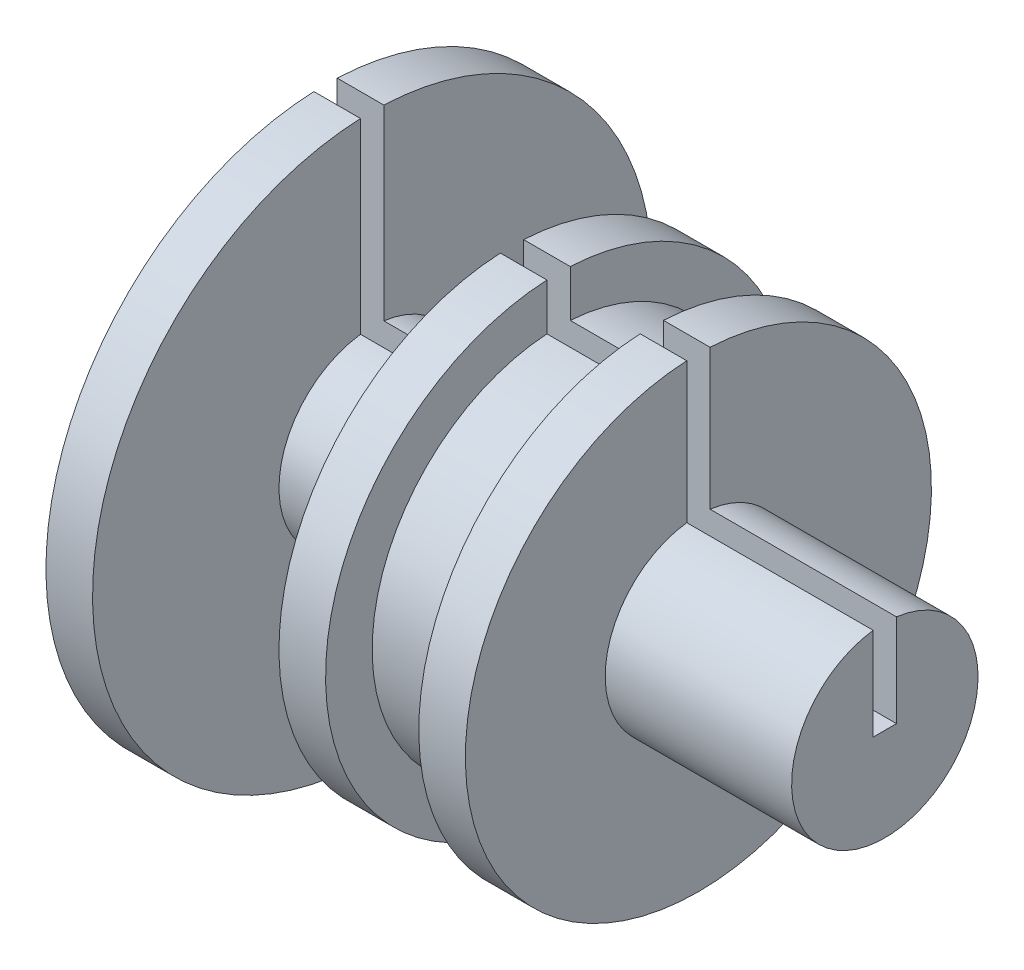
ISO-10303-21;
HEADER;
FILE_DESCRIPTION(('STEP AP214'),'2;1');
FILE_NAME('part.step','',(''),(''),'','','');
FILE_SCHEMA(('AUTOMOTIVE_DESIGN { 1 0 10303 214 1 1 1 1 }'));
ENDSEC;
DATA;
#1=APPLICATION_CONTEXT('core data for automotive mechanical design processes');
#2=APPLICATION_PROTOCOL_DEFINITION('international standard','automotive_design',2000,#1);
#3=PRODUCT_CONTEXT('',#1,'mechanical');
#4=PRODUCT('Part','Part','',(#3));
#5=PRODUCT_RELATED_PRODUCT_CATEGORY('part','',(#4));
#6=PRODUCT_DEFINITION_FORMATION('','',#4);
#7=PRODUCT_DEFINITION_CONTEXT('part definition',#1,'design');
#8=PRODUCT_DEFINITION('design','',#6,#7);
#9=PRODUCT_DEFINITION_SHAPE('','',#8);
#10=(LENGTH_UNIT() NAMED_UNIT(*) SI_UNIT(.MILLI.,.METRE.));
#11=(NAMED_UNIT(*) PLANE_ANGLE_UNIT() SI_UNIT($,.RADIAN.));
#12=(NAMED_UNIT(*) SI_UNIT($,.STERADIAN.) SOLID_ANGLE_UNIT());
#13=UNCERTAINTY_MEASURE_WITH_UNIT(LENGTH_MEASURE(1.E-05),#10,'distance_accuracy_value','');
#14=(GEOMETRIC_REPRESENTATION_CONTEXT(3) GLOBAL_UNCERTAINTY_ASSIGNED_CONTEXT((#13)) GLOBAL_UNIT_ASSIGNED_CONTEXT((#10,
#11,#12)) REPRESENTATION_CONTEXT('',''));
#15=CARTESIAN_POINT('',(0.,0.,0.));
#16=DIRECTION('',(0.,0.,1.));
#17=DIRECTION('',(1.,0.,0.));
#18=AXIS2_PLACEMENT_3D('',#15,#16,#17);
#19=CARTESIAN_POINT('',(0.,30.,0.));
#20=DIRECTION('',(1.,0.,0.));
#21=DIRECTION('',(0.,0.,-1.));
#22=AXIS2_PLACEMENT_3D('',#19,#20,#21);
#23=PLANE('',#22);
#24=CARTESIAN_POINT('',(0.,0.,0.));
#25=DIRECTION('',(-1.,0.,0.));
#26=DIRECTION('',(0.,0.,1.));
#27=AXIS2_PLACEMENT_3D('',#24,#25,#26);
#28=CIRCLE('',#27,30.);
#29=CARTESIAN_POINT('',(0.,29.9739470207045,-1.25));
#30=VERTEX_POINT('',#29);
#31=CARTESIAN_POINT('',(0.,29.9739470207045,1.25));
#32=VERTEX_POINT('',#31);
#33=EDGE_CURVE('E152',#30,#32,#28,.T.);
#34=ORIENTED_EDGE('',*,*,#33,.T.);
#35=DIRECTION('',(0.,-1.,0.));
#36=VECTOR('',#35,1.);
#37=CARTESIAN_POINT('',(0.,34.9570415765441,1.25));
#38=LINE('',#37,#36);
#39=CARTESIAN_POINT('',(0.,0.,1.25));
#40=VERTEX_POINT('',#39);
#41=EDGE_CURVE('E134',#32,#40,#38,.T.);
#42=ORIENTED_EDGE('',*,*,#41,.T.);
#43=DIRECTION('',(0.,0.,-1.));
#44=VECTOR('',#43,1.);
#45=CARTESIAN_POINT('',(0.,0.,1.25));
#46=LINE('',#45,#44);
#47=CARTESIAN_POINT('',(0.,0.,-1.25));
#48=VERTEX_POINT('',#47);
#49=EDGE_CURVE('E144',#40,#48,#46,.T.);
#50=ORIENTED_EDGE('',*,*,#49,.T.);
#51=DIRECTION('',(0.,1.,0.));
#52=VECTOR('',#51,1.);
#53=CARTESIAN_POINT('',(0.,34.9570415765441,-1.25));
#54=LINE('',#53,#52);
#55=EDGE_CURVE('E141',#48,#30,#54,.T.);
#56=ORIENTED_EDGE('',*,*,#55,.T.);
#57=EDGE_LOOP('',(#34,#42,#50,#56));
#58=FACE_BOUND('',#57,.T.);
#59=ADVANCED_FACE('F32',(#58),#23,.F.);
#60=CARTESIAN_POINT('',(60.,0.,0.));
#61=DIRECTION('',(-1.,0.,0.));
#62=DIRECTION('',(0.,0.,1.));
#63=AXIS2_PLACEMENT_3D('',#60,#61,#62);
#64=PLANE('',#63);
#65=DIRECTION('',(0.,0.,-1.));
#66=VECTOR('',#65,1.);
#67=CARTESIAN_POINT('',(60.,0.,1.25));
#68=LINE('',#67,#66);
#69=CARTESIAN_POINT('',(60.,0.,1.25));
#70=VERTEX_POINT('',#69);
#71=CARTESIAN_POINT('',(60.,0.,-1.25));
#72=VERTEX_POINT('',#71);
#73=EDGE_CURVE('E155',#70,#72,#68,.T.);
#74=ORIENTED_EDGE('',*,*,#73,.F.);
#75=DIRECTION('',(0.,-1.,0.));
#76=VECTOR('',#75,1.);
#77=CARTESIAN_POINT('',(60.,34.9570415765441,1.25));
#78=LINE('',#77,#76);
#79=CARTESIAN_POINT('',(60.,9.92156741649222,1.25));
#80=VERTEX_POINT('',#79);
#81=EDGE_CURVE('E136',#80,#70,#78,.T.);
#82=ORIENTED_EDGE('',*,*,#81,.F.);
#83=CARTESIAN_POINT('',(60.,0.,0.));
#84=DIRECTION('',(-1.,0.,0.));
#85=DIRECTION('',(0.,0.,1.));
#86=AXIS2_PLACEMENT_3D('',#83,#84,#85);
#87=CIRCLE('',#86,10.);
#88=CARTESIAN_POINT('',(60.,9.92156741649222,-1.25));
#89=VERTEX_POINT('',#88);
#90=EDGE_CURVE('E248',#89,#80,#87,.T.);
#91=ORIENTED_EDGE('',*,*,#90,.F.);
#92=DIRECTION('',(0.,1.,0.));
#93=VECTOR('',#92,1.);
#94=CARTESIAN_POINT('',(60.,34.9570415765441,-1.25));
#95=LINE('',#94,#93);
#96=EDGE_CURVE('E153',#72,#89,#95,.T.);
#97=ORIENTED_EDGE('',*,*,#96,.F.);
#98=EDGE_LOOP('',(#74,#82,#91,#97));
#99=FACE_BOUND('',#98,.T.);
#100=ADVANCED_FACE('F284',(#99),#64,.F.);
#101=CARTESIAN_POINT('',(0.,0.,0.));
#102=DIRECTION('',(-1.,0.,0.));
#103=DIRECTION('',(0.,0.,1.));
#104=AXIS2_PLACEMENT_3D('',#101,#102,#103);
#105=CYLINDRICAL_SURFACE('',#104,10.);
#106=ORIENTED_EDGE('',*,*,#90,.T.);
#107=DIRECTION('',(-1.,0.,0.));
#108=VECTOR('',#107,1.);
#109=CARTESIAN_POINT('',(0.,9.92156741649222,1.25));
#110=LINE('',#109,#108);
#111=CARTESIAN_POINT('',(40.,9.92156741649222,1.25));
#112=VERTEX_POINT('',#111);
#113=EDGE_CURVE('E215',#80,#112,#110,.T.);
#114=ORIENTED_EDGE('',*,*,#113,.T.);
#115=CARTESIAN_POINT('',(40.,0.,0.));
#116=DIRECTION('',(-1.,0.,0.));
#117=DIRECTION('',(0.,0.,1.));
#118=AXIS2_PLACEMENT_3D('',#115,#116,#117);
#119=CIRCLE('',#118,10.);
#120=CARTESIAN_POINT('',(40.,9.92156741649222,-1.25));
#121=VERTEX_POINT('',#120);
#122=EDGE_CURVE('E245',#121,#112,#119,.T.);
#123=ORIENTED_EDGE('',*,*,#122,.F.);
#124=DIRECTION('',(-1.,0.,0.));
#125=VECTOR('',#124,1.);
#126=CARTESIAN_POINT('',(0.,9.92156741649222,-1.25));
#127=LINE('',#126,#125);
#128=EDGE_CURVE('E187',#121,#89,#127,.F.);
#129=ORIENTED_EDGE('',*,*,#128,.T.);
#130=EDGE_LOOP('',(#106,#114,#123,#129));
#131=FACE_BOUND('',#130,.T.);
#132=ADVANCED_FACE('F281',(#131),#105,.T.);
#133=CARTESIAN_POINT('',(40.,10.,0.));
#134=DIRECTION('',(-1.,0.,0.));
#135=DIRECTION('',(0.,0.,1.));
#136=AXIS2_PLACEMENT_3D('',#133,#134,#135);
#137=PLANE('',#136);
#138=ORIENTED_EDGE('',*,*,#122,.T.);
#139=DIRECTION('',(0.,1.,0.));
#140=VECTOR('',#139,1.);
#141=CARTESIAN_POINT('',(40.,10.,1.25));
#142=LINE('',#141,#140);
#143=CARTESIAN_POINT('',(40.,24.9687304442977,1.25));
#144=VERTEX_POINT('',#143);
#145=EDGE_CURVE('E54',#112,#144,#142,.T.);
#146=ORIENTED_EDGE('',*,*,#145,.T.);
#147=CARTESIAN_POINT('',(40.,0.,0.));
#148=DIRECTION('',(-1.,0.,0.));
#149=DIRECTION('',(0.,0.,1.));
#150=AXIS2_PLACEMENT_3D('',#147,#148,#149);
#151=CIRCLE('',#150,25.);
#152=CARTESIAN_POINT('',(40.,24.9687304442977,-1.25));
#153=VERTEX_POINT('',#152);
#154=EDGE_CURVE('E242',#153,#144,#151,.T.);
#155=ORIENTED_EDGE('',*,*,#154,.F.);
#156=DIRECTION('',(0.,-1.,0.));
#157=VECTOR('',#156,1.);
#158=CARTESIAN_POINT('',(40.,10.,-1.25));
#159=LINE('',#158,#157);
#160=EDGE_CURVE('E184',#153,#121,#159,.T.);
#161=ORIENTED_EDGE('',*,*,#160,.T.);
#162=EDGE_LOOP('',(#138,#146,#155,#161));
#163=FACE_BOUND('',#162,.T.);
#164=ADVANCED_FACE('F278',(#163),#137,.F.);
#165=CARTESIAN_POINT('',(0.,0.,0.));
#166=DIRECTION('',(-1.,0.,0.));
#167=DIRECTION('',(0.,0.,1.));
#168=AXIS2_PLACEMENT_3D('',#165,#166,#167);
#169=CYLINDRICAL_SURFACE('',#168,25.);
#170=ORIENTED_EDGE('',*,*,#154,.T.);
#171=DIRECTION('',(-1.,0.,0.));
#172=VECTOR('',#171,1.);
#173=CARTESIAN_POINT('',(0.,24.9687304442977,1.25));
#174=LINE('',#173,#172);
#175=CARTESIAN_POINT('',(35.,24.9687304442977,1.25));
#176=VERTEX_POINT('',#175);
#177=EDGE_CURVE('E211',#144,#176,#174,.T.);
#178=ORIENTED_EDGE('',*,*,#177,.T.);
#179=CARTESIAN_POINT('',(35.,0.,0.));
#180=DIRECTION('',(-1.,0.,0.));
#181=DIRECTION('',(0.,0.,1.));
#182=AXIS2_PLACEMENT_3D('',#179,#180,#181);
#183=CIRCLE('',#182,25.);
#184=CARTESIAN_POINT('',(35.,24.9687304442977,-1.25));
#185=VERTEX_POINT('',#184);
#186=EDGE_CURVE('E239',#185,#176,#183,.T.);
#187=ORIENTED_EDGE('',*,*,#186,.F.);
#188=DIRECTION('',(-1.,0.,0.));
#189=VECTOR('',#188,1.);
#190=CARTESIAN_POINT('',(0.,24.9687304442977,-1.25));
#191=LINE('',#190,#189);
#192=EDGE_CURVE('E181',#185,#153,#191,.F.);
#193=ORIENTED_EDGE('',*,*,#192,.T.);
#194=EDGE_LOOP('',(#170,#178,#187,#193));
#195=FACE_BOUND('',#194,.T.);
#196=ADVANCED_FACE('F275',(#195),#169,.T.);
#197=CARTESIAN_POINT('',(35.,25.,0.));
#198=DIRECTION('',(1.,0.,0.));
#199=DIRECTION('',(0.,0.,-1.));
#200=AXIS2_PLACEMENT_3D('',#197,#198,#199);
#201=PLANE('',#200);
#202=ORIENTED_EDGE('',*,*,#186,.T.);
#203=DIRECTION('',(0.,-1.,0.));
#204=VECTOR('',#203,1.);
#205=CARTESIAN_POINT('',(35.,25.,1.25));
#206=LINE('',#205,#204);
#207=CARTESIAN_POINT('',(35.,19.9608992783391,1.25));
#208=VERTEX_POINT('',#207);
#209=EDGE_CURVE('E208',#176,#208,#206,.T.);
#210=ORIENTED_EDGE('',*,*,#209,.T.);
#211=CARTESIAN_POINT('',(35.,0.,0.));
#212=DIRECTION('',(-1.,0.,0.));
#213=DIRECTION('',(0.,0.,1.));
#214=AXIS2_PLACEMENT_3D('',#211,#212,#213);
#215=CIRCLE('',#214,20.);
#216=CARTESIAN_POINT('',(35.,19.9608992783391,-1.25));
#217=VERTEX_POINT('',#216);
#218=EDGE_CURVE('E236',#217,#208,#215,.T.);
#219=ORIENTED_EDGE('',*,*,#218,.F.);
#220=DIRECTION('',(0.,1.,0.));
#221=VECTOR('',#220,1.);
#222=CARTESIAN_POINT('',(35.,25.,-1.25));
#223=LINE('',#222,#221);
#224=EDGE_CURVE('E178',#217,#185,#223,.T.);
#225=ORIENTED_EDGE('',*,*,#224,.T.);
#226=EDGE_LOOP('',(#202,#210,#219,#225));
#227=FACE_BOUND('',#226,.T.);
#228=ADVANCED_FACE('F272',(#227),#201,.F.);
#229=CARTESIAN_POINT('',(0.,0.,0.));
#230=DIRECTION('',(-1.,0.,0.));
#231=DIRECTION('',(0.,0.,1.));
#232=AXIS2_PLACEMENT_3D('',#229,#230,#231);
#233=CYLINDRICAL_SURFACE('',#232,20.);
#234=ORIENTED_EDGE('',*,*,#218,.T.);
#235=DIRECTION('',(-1.,0.,0.));
#236=VECTOR('',#235,1.);
#237=CARTESIAN_POINT('',(0.,19.9608992783391,1.25));
#238=LINE('',#237,#236);
#239=CARTESIAN_POINT('',(25.,19.9608992783391,1.25));
#240=VERTEX_POINT('',#239);
#241=EDGE_CURVE('E205',#208,#240,#238,.T.);
#242=ORIENTED_EDGE('',*,*,#241,.T.);
#243=CARTESIAN_POINT('',(25.,0.,0.));
#244=DIRECTION('',(-1.,0.,0.));
#245=DIRECTION('',(0.,0.,1.));
#246=AXIS2_PLACEMENT_3D('',#243,#244,#245);
#247=CIRCLE('',#246,20.);
#248=CARTESIAN_POINT('',(25.,19.9608992783391,-1.25));
#249=VERTEX_POINT('',#248);
#250=EDGE_CURVE('E233',#249,#240,#247,.T.);
#251=ORIENTED_EDGE('',*,*,#250,.F.);
#252=DIRECTION('',(-1.,0.,0.));
#253=VECTOR('',#252,1.);
#254=CARTESIAN_POINT('',(0.,19.9608992783391,-1.25));
#255=LINE('',#254,#253);
#256=EDGE_CURVE('E175',#249,#217,#255,.F.);
#257=ORIENTED_EDGE('',*,*,#256,.T.);
#258=EDGE_LOOP('',(#234,#242,#251,#257));
#259=FACE_BOUND('',#258,.T.);
#260=ADVANCED_FACE('F269',(#259),#233,.T.);
#261=CARTESIAN_POINT('',(25.,25.,0.));
#262=DIRECTION('',(-1.,0.,0.));
#263=DIRECTION('',(0.,0.,1.));
#264=AXIS2_PLACEMENT_3D('',#261,#262,#263);
#265=PLANE('',#264);
#266=ORIENTED_EDGE('',*,*,#250,.T.);
#267=DIRECTION('',(0.,1.,0.));
#268=VECTOR('',#267,1.);
#269=CARTESIAN_POINT('',(25.,25.,1.25));
#270=LINE('',#269,#268);
#271=CARTESIAN_POINT('',(25.,24.9687304442977,1.25));
#272=VERTEX_POINT('',#271);
#273=EDGE_CURVE('E202',#240,#272,#270,.T.);
#274=ORIENTED_EDGE('',*,*,#273,.T.);
#275=CARTESIAN_POINT('',(25.,0.,0.));
#276=DIRECTION('',(-1.,0.,0.));
#277=DIRECTION('',(0.,0.,1.));
#278=AXIS2_PLACEMENT_3D('',#275,#276,#277);
#279=CIRCLE('',#278,25.);
#280=CARTESIAN_POINT('',(25.,24.9687304442977,-1.25));
#281=VERTEX_POINT('',#280);
#282=EDGE_CURVE('E230',#281,#272,#279,.T.);
#283=ORIENTED_EDGE('',*,*,#282,.F.);
#284=DIRECTION('',(0.,-1.,0.));
#285=VECTOR('',#284,1.);
#286=CARTESIAN_POINT('',(25.,25.,-1.25));
#287=LINE('',#286,#285);
#288=EDGE_CURVE('E172',#281,#249,#287,.T.);
#289=ORIENTED_EDGE('',*,*,#288,.T.);
#290=EDGE_LOOP('',(#266,#274,#283,#289));
#291=FACE_BOUND('',#290,.T.);
#292=ADVANCED_FACE('F266',(#291),#265,.F.);
#293=CARTESIAN_POINT('',(0.,0.,0.));
#294=DIRECTION('',(-1.,0.,0.));
#295=DIRECTION('',(0.,0.,1.));
#296=AXIS2_PLACEMENT_3D('',#293,#294,#295);
#297=CYLINDRICAL_SURFACE('',#296,25.);
#298=ORIENTED_EDGE('',*,*,#282,.T.);
#299=DIRECTION('',(-1.,0.,0.));
#300=VECTOR('',#299,1.);
#301=CARTESIAN_POINT('',(0.,24.9687304442977,1.25));
#302=LINE('',#301,#300);
#303=CARTESIAN_POINT('',(20.,24.9687304442977,1.25));
#304=VERTEX_POINT('',#303);
#305=EDGE_CURVE('E199',#272,#304,#302,.T.);
#306=ORIENTED_EDGE('',*,*,#305,.T.);
#307=CARTESIAN_POINT('',(20.,0.,0.));
#308=DIRECTION('',(-1.,0.,0.));
#309=DIRECTION('',(0.,0.,1.));
#310=AXIS2_PLACEMENT_3D('',#307,#308,#309);
#311=CIRCLE('',#310,25.);
#312=CARTESIAN_POINT('',(20.,24.9687304442977,-1.25));
#313=VERTEX_POINT('',#312);
#314=EDGE_CURVE('E227',#313,#304,#311,.T.);
#315=ORIENTED_EDGE('',*,*,#314,.F.);
#316=DIRECTION('',(-1.,0.,0.));
#317=VECTOR('',#316,1.);
#318=CARTESIAN_POINT('',(0.,24.9687304442977,-1.25));
#319=LINE('',#318,#317);
#320=EDGE_CURVE('E169',#313,#281,#319,.F.);
#321=ORIENTED_EDGE('',*,*,#320,.T.);
#322=EDGE_LOOP('',(#298,#306,#315,#321));
#323=FACE_BOUND('',#322,.T.);
#324=ADVANCED_FACE('F263',(#323),#297,.T.);
#325=CARTESIAN_POINT('',(20.,10.,0.));
#326=DIRECTION('',(1.,0.,0.));
#327=DIRECTION('',(0.,0.,-1.));
#328=AXIS2_PLACEMENT_3D('',#325,#326,#327);
#329=PLANE('',#328);
#330=ORIENTED_EDGE('',*,*,#314,.T.);
#331=DIRECTION('',(0.,-1.,0.));
#332=VECTOR('',#331,1.);
#333=CARTESIAN_POINT('',(20.,10.,1.25));
#334=LINE('',#333,#332);
#335=CARTESIAN_POINT('',(20.,9.92156741649222,1.25));
#336=VERTEX_POINT('',#335);
#337=EDGE_CURVE('E196',#304,#336,#334,.T.);
#338=ORIENTED_EDGE('',*,*,#337,.T.);
#339=CARTESIAN_POINT('',(20.,0.,0.));
#340=DIRECTION('',(-1.,0.,0.));
#341=DIRECTION('',(0.,0.,1.));
#342=AXIS2_PLACEMENT_3D('',#339,#340,#341);
#343=CIRCLE('',#342,10.);
#344=CARTESIAN_POINT('',(20.,9.92156741649222,-1.25));
#345=VERTEX_POINT('',#344);
#346=EDGE_CURVE('E224',#345,#336,#343,.T.);
#347=ORIENTED_EDGE('',*,*,#346,.F.);
#348=DIRECTION('',(0.,1.,0.));
#349=VECTOR('',#348,1.);
#350=CARTESIAN_POINT('',(20.,10.,-1.25));
#351=LINE('',#350,#349);
#352=EDGE_CURVE('E166',#345,#313,#351,.T.);
#353=ORIENTED_EDGE('',*,*,#352,.T.);
#354=EDGE_LOOP('',(#330,#338,#347,#353));
#355=FACE_BOUND('',#354,.T.);
#356=ADVANCED_FACE('F260',(#355),#329,.F.);
#357=CARTESIAN_POINT('',(0.,0.,0.));
#358=DIRECTION('',(-1.,0.,0.));
#359=DIRECTION('',(0.,0.,1.));
#360=AXIS2_PLACEMENT_3D('',#357,#358,#359);
#361=CYLINDRICAL_SURFACE('',#360,10.);
#362=ORIENTED_EDGE('',*,*,#346,.T.);
#363=DIRECTION('',(-1.,0.,0.));
#364=VECTOR('',#363,1.);
#365=CARTESIAN_POINT('',(0.,9.92156741649222,1.25));
#366=LINE('',#365,#364);
#367=CARTESIAN_POINT('',(5.,9.92156741649221,1.25));
#368=VERTEX_POINT('',#367);
#369=EDGE_CURVE('E193',#336,#368,#366,.T.);
#370=ORIENTED_EDGE('',*,*,#369,.T.);
#371=CARTESIAN_POINT('',(5.,0.,0.));
#372=DIRECTION('',(-1.,0.,0.));
#373=DIRECTION('',(0.,0.,1.));
#374=AXIS2_PLACEMENT_3D('',#371,#372,#373);
#375=CIRCLE('',#374,10.);
#376=CARTESIAN_POINT('',(5.,9.92156741649221,-1.25));
#377=VERTEX_POINT('',#376);
#378=EDGE_CURVE('E221',#377,#368,#375,.T.);
#379=ORIENTED_EDGE('',*,*,#378,.F.);
#380=DIRECTION('',(-1.,0.,0.));
#381=VECTOR('',#380,1.);
#382=CARTESIAN_POINT('',(0.,9.92156741649222,-1.25));
#383=LINE('',#382,#381);
#384=EDGE_CURVE('E163',#377,#345,#383,.F.);
#385=ORIENTED_EDGE('',*,*,#384,.T.);
#386=EDGE_LOOP('',(#362,#370,#379,#385));
#387=FACE_BOUND('',#386,.T.);
#388=ADVANCED_FACE('F257',(#387),#361,.T.);
#389=CARTESIAN_POINT('',(5.,10.,0.));
#390=DIRECTION('',(-1.,0.,0.));
#391=DIRECTION('',(0.,0.,1.));
#392=AXIS2_PLACEMENT_3D('',#389,#390,#391);
#393=PLANE('',#392);
#394=ORIENTED_EDGE('',*,*,#378,.T.);
#395=DIRECTION('',(0.,1.,0.));
#396=VECTOR('',#395,1.);
#397=CARTESIAN_POINT('',(5.,10.,1.25));
#398=LINE('',#397,#396);
#399=CARTESIAN_POINT('',(5.,29.9739470207045,1.25));
#400=VERTEX_POINT('',#399);
#401=EDGE_CURVE('E190',#368,#400,#398,.T.);
#402=ORIENTED_EDGE('',*,*,#401,.T.);
#403=CARTESIAN_POINT('',(5.,0.,0.));
#404=DIRECTION('',(-1.,0.,0.));
#405=DIRECTION('',(0.,0.,1.));
#406=AXIS2_PLACEMENT_3D('',#403,#404,#405);
#407=CIRCLE('',#406,30.);
#408=CARTESIAN_POINT('',(5.,29.9739470207045,-1.25));
#409=VERTEX_POINT('',#408);
#410=EDGE_CURVE('E218',#409,#400,#407,.T.);
#411=ORIENTED_EDGE('',*,*,#410,.F.);
#412=DIRECTION('',(0.,-1.,0.));
#413=VECTOR('',#412,1.);
#414=CARTESIAN_POINT('',(5.,10.,-1.25));
#415=LINE('',#414,#413);
#416=EDGE_CURVE('E46',#409,#377,#415,.T.);
#417=ORIENTED_EDGE('',*,*,#416,.T.);
#418=EDGE_LOOP('',(#394,#402,#411,#417));
#419=FACE_BOUND('',#418,.T.);
#420=ADVANCED_FACE('F254',(#419),#393,.F.);
#421=CARTESIAN_POINT('',(0.,0.,0.));
#422=DIRECTION('',(-1.,0.,0.));
#423=DIRECTION('',(0.,0.,1.));
#424=AXIS2_PLACEMENT_3D('',#421,#422,#423);
#425=CYLINDRICAL_SURFACE('',#424,30.);
#426=ORIENTED_EDGE('',*,*,#410,.T.);
#427=DIRECTION('',(-1.,0.,0.));
#428=VECTOR('',#427,1.);
#429=CARTESIAN_POINT('',(0.,29.9739470207045,1.25));
#430=LINE('',#429,#428);
#431=EDGE_CURVE('E11',#400,#32,#430,.T.);
#432=ORIENTED_EDGE('',*,*,#431,.T.);
#433=ORIENTED_EDGE('',*,*,#33,.F.);
#434=DIRECTION('',(-1.,0.,0.));
#435=VECTOR('',#434,1.);
#436=CARTESIAN_POINT('',(0.,29.9739470207045,-1.25));
#437=LINE('',#436,#435);
#438=EDGE_CURVE('E39',#30,#409,#437,.F.);
#439=ORIENTED_EDGE('',*,*,#438,.T.);
#440=EDGE_LOOP('',(#426,#432,#433,#439));
#441=FACE_BOUND('',#440,.T.);
#442=ADVANCED_FACE('F252',(#441),#425,.T.);
#443=CARTESIAN_POINT('',(0.,34.9570415765441,1.25));
#444=DIRECTION('',(0.,0.,1.));
#445=DIRECTION('',(0.,-1.,0.));
#446=AXIS2_PLACEMENT_3D('',#443,#444,#445);
#447=PLANE('',#446);
#448=ORIENTED_EDGE('',*,*,#81,.T.);
#449=DIRECTION('',(1.,0.,0.));
#450=VECTOR('',#449,1.);
#451=CARTESIAN_POINT('',(0.,0.,1.25));
#452=LINE('',#451,#450);
#453=EDGE_CURVE('E130',#40,#70,#452,.T.);
#454=ORIENTED_EDGE('',*,*,#453,.F.);
#455=ORIENTED_EDGE('',*,*,#41,.F.);
#456=ORIENTED_EDGE('',*,*,#431,.F.);
#457=ORIENTED_EDGE('',*,*,#401,.F.);
#458=ORIENTED_EDGE('',*,*,#369,.F.);
#459=ORIENTED_EDGE('',*,*,#337,.F.);
#460=ORIENTED_EDGE('',*,*,#305,.F.);
#461=ORIENTED_EDGE('',*,*,#273,.F.);
#462=ORIENTED_EDGE('',*,*,#241,.F.);
#463=ORIENTED_EDGE('',*,*,#209,.F.);
#464=ORIENTED_EDGE('',*,*,#177,.F.);
#465=ORIENTED_EDGE('',*,*,#145,.F.);
#466=ORIENTED_EDGE('',*,*,#113,.F.);
#467=EDGE_LOOP('',(#448,#454,#455,#456,#457,#458,#459,#460,#461,#462,#463,#464,#465,#466));
#468=FACE_BOUND('',#467,.T.);
#469=ADVANCED_FACE('F132',(#468),#447,.F.);
#470=CARTESIAN_POINT('',(0.,34.9570415765441,-1.25));
#471=DIRECTION('',(0.,0.,-1.));
#472=DIRECTION('',(0.,1.,0.));
#473=AXIS2_PLACEMENT_3D('',#470,#471,#472);
#474=PLANE('',#473);
#475=ORIENTED_EDGE('',*,*,#160,.F.);
#476=ORIENTED_EDGE('',*,*,#192,.F.);
#477=ORIENTED_EDGE('',*,*,#224,.F.);
#478=ORIENTED_EDGE('',*,*,#256,.F.);
#479=ORIENTED_EDGE('',*,*,#288,.F.);
#480=ORIENTED_EDGE('',*,*,#320,.F.);
#481=ORIENTED_EDGE('',*,*,#352,.F.);
#482=ORIENTED_EDGE('',*,*,#384,.F.);
#483=ORIENTED_EDGE('',*,*,#416,.F.);
#484=ORIENTED_EDGE('',*,*,#438,.F.);
#485=ORIENTED_EDGE('',*,*,#55,.F.);
#486=DIRECTION('',(1.,0.,0.));
#487=VECTOR('',#486,1.);
#488=CARTESIAN_POINT('',(0.,0.,-1.25));
#489=LINE('',#488,#487);
#490=EDGE_CURVE('E140',#48,#72,#489,.T.);
#491=ORIENTED_EDGE('',*,*,#490,.T.);
#492=ORIENTED_EDGE('',*,*,#96,.T.);
#493=ORIENTED_EDGE('',*,*,#128,.F.);
#494=EDGE_LOOP('',(#475,#476,#477,#478,#479,#480,#481,#482,#483,#484,#485,#491,#492,#493));
#495=FACE_BOUND('',#494,.T.);
#496=ADVANCED_FACE('F286',(#495),#474,.F.);
#497=CARTESIAN_POINT('',(0.,0.,1.25));
#498=DIRECTION('',(0.,-1.,0.));
#499=DIRECTION('',(0.,0.,-1.));
#500=AXIS2_PLACEMENT_3D('',#497,#498,#499);
#501=PLANE('',#500);
#502=ORIENTED_EDGE('',*,*,#73,.T.);
#503=ORIENTED_EDGE('',*,*,#490,.F.);
#504=ORIENTED_EDGE('',*,*,#49,.F.);
#505=ORIENTED_EDGE('',*,*,#453,.T.);
#506=EDGE_LOOP('',(#502,#503,#504,#505));
#507=FACE_BOUND('',#506,.T.);
#508=ADVANCED_FACE('F145',(#507),#501,.F.);
#509=CLOSED_SHELL('',(#59,#100,#132,#164,#196,#228,#260,#292,#324,#356,#388,#420,#442,#469,#496,#508));
#510=MANIFOLD_SOLID_BREP('B2',#509);
#511=ADVANCED_BREP_SHAPE_REPRESENTATION('',(#18,#510),#14);
#512=SHAPE_DEFINITION_REPRESENTATION(#9,#511);
ENDSEC;
END-ISO-10303-21;
